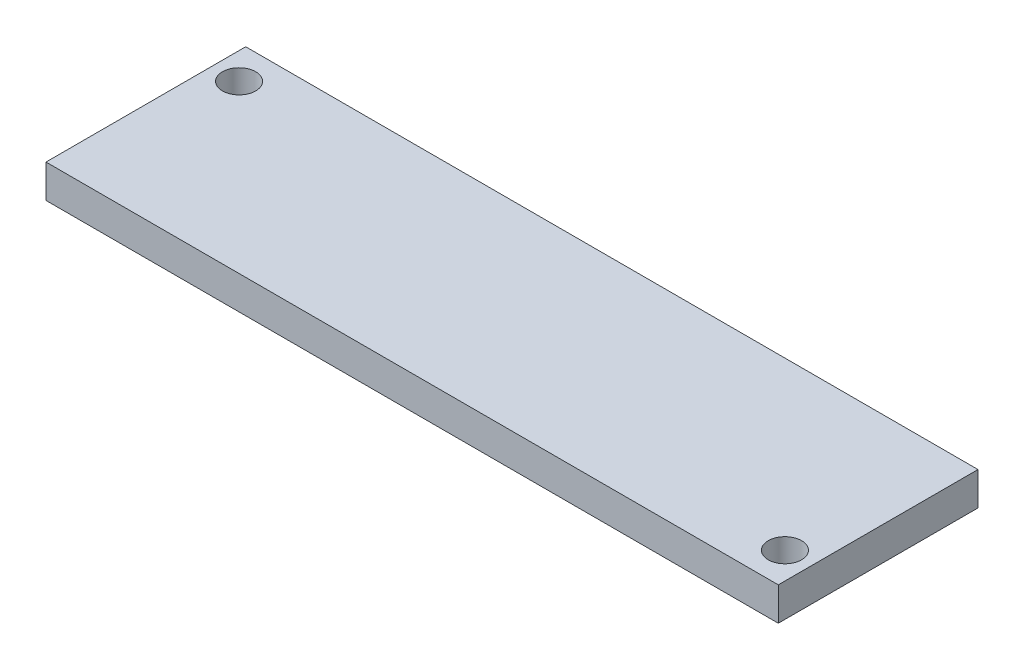
ISO-10303-21;
HEADER;
FILE_DESCRIPTION(('STEP AP214'),'2;1');
FILE_NAME('part.step','',(''),(''),'','','');
FILE_SCHEMA(('AUTOMOTIVE_DESIGN { 1 0 10303 214 1 1 1 1 }'));
ENDSEC;
DATA;
#1=APPLICATION_CONTEXT('core data for automotive mechanical design processes');
#2=APPLICATION_PROTOCOL_DEFINITION('international standard','automotive_design',2000,#1);
#3=PRODUCT_CONTEXT('',#1,'mechanical');
#4=PRODUCT('Part','Part','',(#3));
#5=PRODUCT_RELATED_PRODUCT_CATEGORY('part','',(#4));
#6=PRODUCT_DEFINITION_FORMATION('','',#4);
#7=PRODUCT_DEFINITION_CONTEXT('part definition',#1,'design');
#8=PRODUCT_DEFINITION('design','',#6,#7);
#9=PRODUCT_DEFINITION_SHAPE('','',#8);
#10=(LENGTH_UNIT() NAMED_UNIT(*) SI_UNIT(.MILLI.,.METRE.));
#11=(NAMED_UNIT(*) PLANE_ANGLE_UNIT() SI_UNIT($,.RADIAN.));
#12=(NAMED_UNIT(*) SI_UNIT($,.STERADIAN.) SOLID_ANGLE_UNIT());
#13=UNCERTAINTY_MEASURE_WITH_UNIT(LENGTH_MEASURE(1.E-05),#10,'distance_accuracy_value','');
#14=(GEOMETRIC_REPRESENTATION_CONTEXT(3) GLOBAL_UNCERTAINTY_ASSIGNED_CONTEXT((#13)) GLOBAL_UNIT_ASSIGNED_CONTEXT((#10,
#11,#12)) REPRESENTATION_CONTEXT('',''));
#15=CARTESIAN_POINT('',(0.,0.,0.));
#16=DIRECTION('',(0.,0.,1.));
#17=DIRECTION('',(1.,0.,0.));
#18=AXIS2_PLACEMENT_3D('',#15,#16,#17);
#19=CARTESIAN_POINT('',(0.,5.,0.));
#20=DIRECTION('',(0.,-1.,0.));
#21=DIRECTION('',(0.,0.,-1.));
#22=AXIS2_PLACEMENT_3D('',#19,#20,#21);
#23=PLANE('',#22);
#24=DIRECTION('',(0.,0.,-1.));
#25=VECTOR('',#24,1.);
#26=CARTESIAN_POINT('',(55.,5.,15.));
#27=LINE('',#26,#25);
#28=CARTESIAN_POINT('',(55.,5.,15.));
#29=VERTEX_POINT('',#28);
#30=CARTESIAN_POINT('',(55.,5.,-15.));
#31=VERTEX_POINT('',#30);
#32=EDGE_CURVE('E84',#29,#31,#27,.T.);
#33=ORIENTED_EDGE('',*,*,#32,.T.);
#34=DIRECTION('',(-1.,0.,0.));
#35=VECTOR('',#34,1.);
#36=CARTESIAN_POINT('',(-55.,5.,-15.));
#37=LINE('',#36,#35);
#38=CARTESIAN_POINT('',(-55.,5.,-15.));
#39=VERTEX_POINT('',#38);
#40=EDGE_CURVE('E79',#31,#39,#37,.T.);
#41=ORIENTED_EDGE('',*,*,#40,.T.);
#42=DIRECTION('',(0.,0.,1.));
#43=VECTOR('',#42,1.);
#44=CARTESIAN_POINT('',(-55.,5.,15.));
#45=LINE('',#44,#43);
#46=CARTESIAN_POINT('',(-55.,5.,15.));
#47=VERTEX_POINT('',#46);
#48=EDGE_CURVE('E82',#39,#47,#45,.T.);
#49=ORIENTED_EDGE('',*,*,#48,.T.);
#50=DIRECTION('',(1.,0.,0.));
#51=VECTOR('',#50,1.);
#52=CARTESIAN_POINT('',(-55.,5.,15.));
#53=LINE('',#52,#51);
#54=EDGE_CURVE('E49',#47,#29,#53,.T.);
#55=ORIENTED_EDGE('',*,*,#54,.T.);
#56=EDGE_LOOP('',(#33,#41,#49,#55));
#57=FACE_BOUND('',#56,.T.);
#58=CARTESIAN_POINT('',(-51.,5.,-10.));
#59=DIRECTION('',(0.,1.,0.));
#60=DIRECTION('',(0.,0.,1.));
#61=AXIS2_PLACEMENT_3D('',#58,#59,#60);
#62=CIRCLE('',#61,2.5);
#63=CARTESIAN_POINT('',(-51.,5.,-7.5));
#64=VERTEX_POINT('',#63);
#65=EDGE_CURVE('E99',#64,#64,#62,.T.);
#66=ORIENTED_EDGE('',*,*,#65,.F.);
#67=EDGE_LOOP('',(#66));
#68=FACE_BOUND('',#67,.T.);
#69=CARTESIAN_POINT('',(51.,5.,10.));
#70=DIRECTION('',(0.,1.,0.));
#71=DIRECTION('',(0.,0.,1.));
#72=AXIS2_PLACEMENT_3D('',#69,#70,#71);
#73=CIRCLE('',#72,2.5);
#74=CARTESIAN_POINT('',(51.,5.,12.5));
#75=VERTEX_POINT('',#74);
#76=EDGE_CURVE('E114',#75,#75,#73,.T.);
#77=ORIENTED_EDGE('',*,*,#76,.F.);
#78=EDGE_LOOP('',(#77));
#79=FACE_BOUND('',#78,.T.);
#80=ADVANCED_FACE('F32',(#57,#68,#79),#23,.F.);
#81=CARTESIAN_POINT('',(0.,0.,0.));
#82=DIRECTION('',(0.,-1.,0.));
#83=DIRECTION('',(0.,0.,-1.));
#84=AXIS2_PLACEMENT_3D('',#81,#82,#83);
#85=PLANE('',#84);
#86=CARTESIAN_POINT('',(-51.,0.,-10.));
#87=DIRECTION('',(0.,1.,0.));
#88=DIRECTION('',(0.,0.,1.));
#89=AXIS2_PLACEMENT_3D('',#86,#87,#88);
#90=CIRCLE('',#89,2.5);
#91=CARTESIAN_POINT('',(-51.,0.,-7.5));
#92=VERTEX_POINT('',#91);
#93=EDGE_CURVE('E111',#92,#92,#90,.T.);
#94=ORIENTED_EDGE('',*,*,#93,.T.);
#95=EDGE_LOOP('',(#94));
#96=FACE_BOUND('',#95,.T.);
#97=DIRECTION('',(0.,0.,-1.));
#98=VECTOR('',#97,1.);
#99=CARTESIAN_POINT('',(55.,0.,15.));
#100=LINE('',#99,#98);
#101=CARTESIAN_POINT('',(55.,0.,15.));
#102=VERTEX_POINT('',#101);
#103=CARTESIAN_POINT('',(55.,0.,-15.));
#104=VERTEX_POINT('',#103);
#105=EDGE_CURVE('E96',#102,#104,#100,.T.);
#106=ORIENTED_EDGE('',*,*,#105,.F.);
#107=DIRECTION('',(1.,0.,0.));
#108=VECTOR('',#107,1.);
#109=CARTESIAN_POINT('',(-55.,0.,15.));
#110=LINE('',#109,#108);
#111=CARTESIAN_POINT('',(-55.,0.,15.));
#112=VERTEX_POINT('',#111);
#113=EDGE_CURVE('E72',#112,#102,#110,.T.);
#114=ORIENTED_EDGE('',*,*,#113,.F.);
#115=DIRECTION('',(0.,0.,1.));
#116=VECTOR('',#115,1.);
#117=CARTESIAN_POINT('',(-55.,0.,15.));
#118=LINE('',#117,#116);
#119=CARTESIAN_POINT('',(-55.,0.,-15.));
#120=VERTEX_POINT('',#119);
#121=EDGE_CURVE('E66',#120,#112,#118,.T.);
#122=ORIENTED_EDGE('',*,*,#121,.F.);
#123=DIRECTION('',(-1.,0.,0.));
#124=VECTOR('',#123,1.);
#125=CARTESIAN_POINT('',(-55.,0.,-15.));
#126=LINE('',#125,#124);
#127=EDGE_CURVE('E88',#104,#120,#126,.T.);
#128=ORIENTED_EDGE('',*,*,#127,.F.);
#129=EDGE_LOOP('',(#106,#114,#122,#128));
#130=FACE_BOUND('',#129,.T.);
#131=CARTESIAN_POINT('',(51.,0.,10.));
#132=DIRECTION('',(0.,1.,0.));
#133=DIRECTION('',(0.,0.,1.));
#134=AXIS2_PLACEMENT_3D('',#131,#132,#133);
#135=CIRCLE('',#134,2.5);
#136=CARTESIAN_POINT('',(51.,0.,12.5));
#137=VERTEX_POINT('',#136);
#138=EDGE_CURVE('E117',#137,#137,#135,.T.);
#139=ORIENTED_EDGE('',*,*,#138,.T.);
#140=EDGE_LOOP('',(#139));
#141=FACE_BOUND('',#140,.T.);
#142=ADVANCED_FACE('F107',(#96,#130,#141),#85,.T.);
#143=CARTESIAN_POINT('',(55.,5.,15.));
#144=DIRECTION('',(-1.,0.,0.));
#145=DIRECTION('',(0.,0.,1.));
#146=AXIS2_PLACEMENT_3D('',#143,#144,#145);
#147=PLANE('',#146);
#148=ORIENTED_EDGE('',*,*,#105,.T.);
#149=DIRECTION('',(0.,-1.,0.));
#150=VECTOR('',#149,1.);
#151=CARTESIAN_POINT('',(55.,5.,-15.));
#152=LINE('',#151,#150);
#153=EDGE_CURVE('E11',#31,#104,#152,.T.);
#154=ORIENTED_EDGE('',*,*,#153,.F.);
#155=ORIENTED_EDGE('',*,*,#32,.F.);
#156=DIRECTION('',(0.,-1.,0.));
#157=VECTOR('',#156,1.);
#158=CARTESIAN_POINT('',(55.,5.,15.));
#159=LINE('',#158,#157);
#160=EDGE_CURVE('E92',#29,#102,#159,.T.);
#161=ORIENTED_EDGE('',*,*,#160,.T.);
#162=EDGE_LOOP('',(#148,#154,#155,#161));
#163=FACE_BOUND('',#162,.T.);
#164=ADVANCED_FACE('F34',(#163),#147,.F.);
#165=CARTESIAN_POINT('',(-55.,5.,-15.));
#166=DIRECTION('',(0.,0.,1.));
#167=DIRECTION('',(1.,0.,0.));
#168=AXIS2_PLACEMENT_3D('',#165,#166,#167);
#169=PLANE('',#168);
#170=ORIENTED_EDGE('',*,*,#127,.T.);
#171=DIRECTION('',(0.,-1.,0.));
#172=VECTOR('',#171,1.);
#173=CARTESIAN_POINT('',(-55.,5.,-15.));
#174=LINE('',#173,#172);
#175=EDGE_CURVE('E41',#39,#120,#174,.T.);
#176=ORIENTED_EDGE('',*,*,#175,.F.);
#177=ORIENTED_EDGE('',*,*,#40,.F.);
#178=ORIENTED_EDGE('',*,*,#153,.T.);
#179=EDGE_LOOP('',(#170,#176,#177,#178));
#180=FACE_BOUND('',#179,.T.);
#181=ADVANCED_FACE('F87',(#180),#169,.F.);
#182=CARTESIAN_POINT('',(-55.,5.,15.));
#183=DIRECTION('',(1.,0.,0.));
#184=DIRECTION('',(0.,0.,-1.));
#185=AXIS2_PLACEMENT_3D('',#182,#183,#184);
#186=PLANE('',#185);
#187=ORIENTED_EDGE('',*,*,#121,.T.);
#188=DIRECTION('',(0.,-1.,0.));
#189=VECTOR('',#188,1.);
#190=CARTESIAN_POINT('',(-55.,5.,15.));
#191=LINE('',#190,#189);
#192=EDGE_CURVE('E89',#47,#112,#191,.T.);
#193=ORIENTED_EDGE('',*,*,#192,.F.);
#194=ORIENTED_EDGE('',*,*,#48,.F.);
#195=ORIENTED_EDGE('',*,*,#175,.T.);
#196=EDGE_LOOP('',(#187,#193,#194,#195));
#197=FACE_BOUND('',#196,.T.);
#198=ADVANCED_FACE('F90',(#197),#186,.F.);
#199=CARTESIAN_POINT('',(-55.,5.,15.));
#200=DIRECTION('',(0.,0.,-1.));
#201=DIRECTION('',(-1.,0.,0.));
#202=AXIS2_PLACEMENT_3D('',#199,#200,#201);
#203=PLANE('',#202);
#204=ORIENTED_EDGE('',*,*,#113,.T.);
#205=ORIENTED_EDGE('',*,*,#160,.F.);
#206=ORIENTED_EDGE('',*,*,#54,.F.);
#207=ORIENTED_EDGE('',*,*,#192,.T.);
#208=EDGE_LOOP('',(#204,#205,#206,#207));
#209=FACE_BOUND('',#208,.T.);
#210=ADVANCED_FACE('F104',(#209),#203,.F.);
#211=CARTESIAN_POINT('',(-51.,5.,-10.));
#212=DIRECTION('',(0.,-1.,0.));
#213=DIRECTION('',(0.,0.,-1.));
#214=AXIS2_PLACEMENT_3D('',#211,#212,#213);
#215=CYLINDRICAL_SURFACE('',#214,2.5);
#216=ORIENTED_EDGE('',*,*,#65,.T.);
#217=EDGE_LOOP('',(#216));
#218=FACE_BOUND('',#217,.T.);
#219=ORIENTED_EDGE('',*,*,#93,.F.);
#220=EDGE_LOOP('',(#219));
#221=FACE_BOUND('',#220,.T.);
#222=ADVANCED_FACE('F134',(#218,#221),#215,.F.);
#223=CARTESIAN_POINT('',(51.,5.,10.));
#224=DIRECTION('',(0.,-1.,0.));
#225=DIRECTION('',(0.,0.,-1.));
#226=AXIS2_PLACEMENT_3D('',#223,#224,#225);
#227=CYLINDRICAL_SURFACE('',#226,2.5);
#228=ORIENTED_EDGE('',*,*,#76,.T.);
#229=EDGE_LOOP('',(#228));
#230=FACE_BOUND('',#229,.T.);
#231=ORIENTED_EDGE('',*,*,#138,.F.);
#232=EDGE_LOOP('',(#231));
#233=FACE_BOUND('',#232,.T.);
#234=ADVANCED_FACE('F123',(#230,#233),#227,.F.);
#235=CLOSED_SHELL('',(#80,#142,#164,#181,#198,#210,#222,#234));
#236=MANIFOLD_SOLID_BREP('B2',#235);
#237=ADVANCED_BREP_SHAPE_REPRESENTATION('',(#18,#236),#14);
#238=SHAPE_DEFINITION_REPRESENTATION(#9,#237);
ENDSEC;
END-ISO-10303-21;
